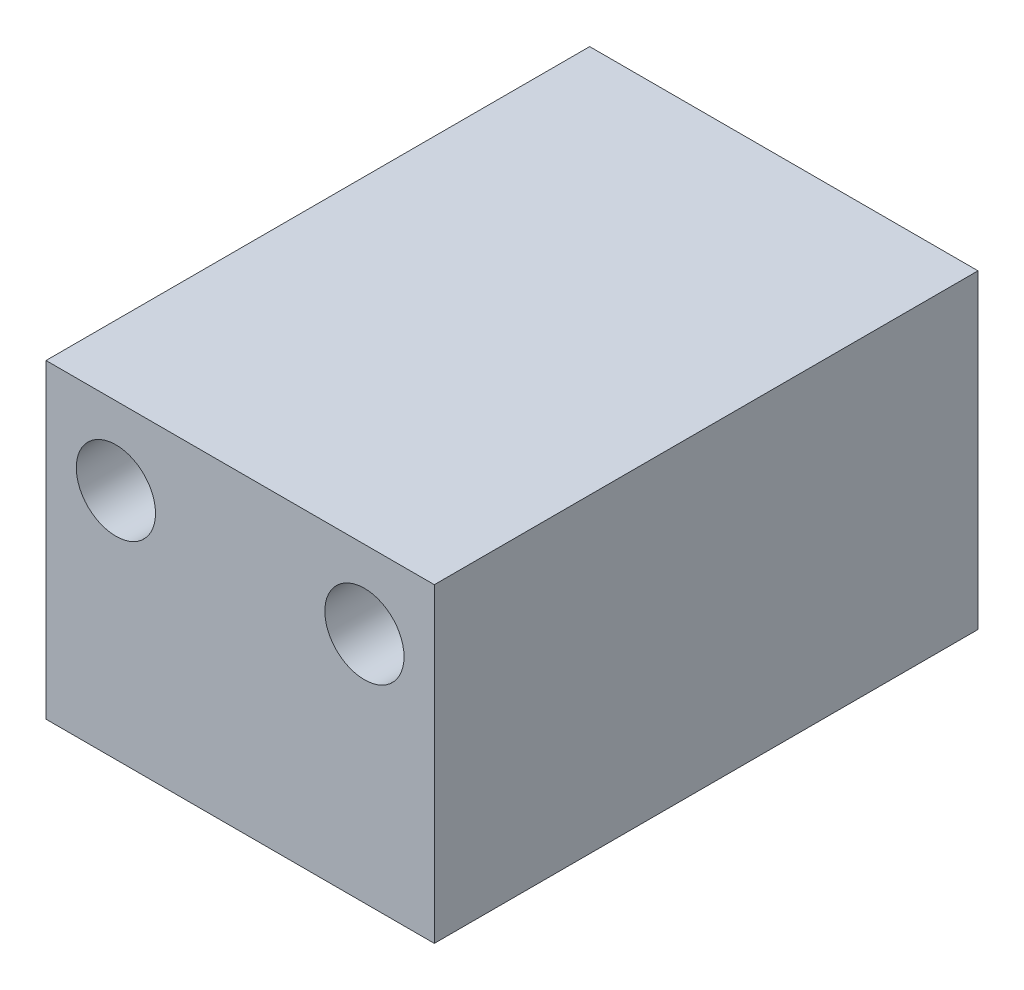
ISO-10303-21;
HEADER;
FILE_DESCRIPTION(('STEP AP214'),'2;1');
FILE_NAME('part.step','',(''),(''),'','','');
FILE_SCHEMA(('AUTOMOTIVE_DESIGN { 1 0 10303 214 1 1 1 1 }'));
ENDSEC;
DATA;
#1=APPLICATION_CONTEXT('core data for automotive mechanical design processes');
#2=APPLICATION_PROTOCOL_DEFINITION('international standard','automotive_design',2000,#1);
#3=PRODUCT_CONTEXT('',#1,'mechanical');
#4=PRODUCT('Part','Part','',(#3));
#5=PRODUCT_RELATED_PRODUCT_CATEGORY('part','',(#4));
#6=PRODUCT_DEFINITION_FORMATION('','',#4);
#7=PRODUCT_DEFINITION_CONTEXT('part definition',#1,'design');
#8=PRODUCT_DEFINITION('design','',#6,#7);
#9=PRODUCT_DEFINITION_SHAPE('','',#8);
#10=(LENGTH_UNIT() NAMED_UNIT(*) SI_UNIT(.MILLI.,.METRE.));
#11=(NAMED_UNIT(*) PLANE_ANGLE_UNIT() SI_UNIT($,.RADIAN.));
#12=(NAMED_UNIT(*) SI_UNIT($,.STERADIAN.) SOLID_ANGLE_UNIT());
#13=UNCERTAINTY_MEASURE_WITH_UNIT(LENGTH_MEASURE(1.E-05),#10,'distance_accuracy_value','');
#14=(GEOMETRIC_REPRESENTATION_CONTEXT(3) GLOBAL_UNCERTAINTY_ASSIGNED_CONTEXT((#13)) GLOBAL_UNIT_ASSIGNED_CONTEXT((#10,
#11,#12)) REPRESENTATION_CONTEXT('',''));
#15=CARTESIAN_POINT('',(0.,0.,0.));
#16=DIRECTION('',(0.,0.,1.));
#17=DIRECTION('',(1.,0.,0.));
#18=AXIS2_PLACEMENT_3D('',#15,#16,#17);
#19=CARTESIAN_POINT('',(0.,20.,0.));
#20=DIRECTION('',(1.,0.,0.));
#21=DIRECTION('',(0.,0.,-1.));
#22=AXIS2_PLACEMENT_3D('',#19,#20,#21);
#23=PLANE('',#22);
#24=DIRECTION('',(0.,0.,1.));
#25=VECTOR('',#24,1.);
#26=CARTESIAN_POINT('',(0.,0.,0.));
#27=LINE('',#26,#25);
#28=CARTESIAN_POINT('',(0.,0.,-35.));
#29=VERTEX_POINT('',#28);
#30=CARTESIAN_POINT('',(0.,0.,0.));
#31=VERTEX_POINT('',#30);
#32=EDGE_CURVE('E97',#29,#31,#27,.T.);
#33=ORIENTED_EDGE('',*,*,#32,.T.);
#34=DIRECTION('',(0.,-1.,0.));
#35=VECTOR('',#34,1.);
#36=CARTESIAN_POINT('',(0.,20.,0.));
#37=LINE('',#36,#35);
#38=CARTESIAN_POINT('',(0.,20.,0.));
#39=VERTEX_POINT('',#38);
#40=EDGE_CURVE('E11',#39,#31,#37,.T.);
#41=ORIENTED_EDGE('',*,*,#40,.F.);
#42=DIRECTION('',(0.,0.,1.));
#43=VECTOR('',#42,1.);
#44=CARTESIAN_POINT('',(0.,20.,0.));
#45=LINE('',#44,#43);
#46=CARTESIAN_POINT('',(0.,20.,-35.));
#47=VERTEX_POINT('',#46);
#48=EDGE_CURVE('E85',#47,#39,#45,.T.);
#49=ORIENTED_EDGE('',*,*,#48,.F.);
#50=DIRECTION('',(0.,-1.,0.));
#51=VECTOR('',#50,1.);
#52=CARTESIAN_POINT('',(0.,20.,-35.));
#53=LINE('',#52,#51);
#54=EDGE_CURVE('E93',#47,#29,#53,.T.);
#55=ORIENTED_EDGE('',*,*,#54,.T.);
#56=EDGE_LOOP('',(#33,#41,#49,#55));
#57=FACE_BOUND('',#56,.T.);
#58=ADVANCED_FACE('F34',(#57),#23,.F.);
#59=CARTESIAN_POINT('',(0.,20.,0.));
#60=DIRECTION('',(0.,0.,-1.));
#61=DIRECTION('',(-1.,0.,0.));
#62=AXIS2_PLACEMENT_3D('',#59,#60,#61);
#63=PLANE('',#62);
#64=CARTESIAN_POINT('',(20.5,15.,0.));
#65=DIRECTION('',(0.,0.,1.));
#66=DIRECTION('',(1.,0.,0.));
#67=AXIS2_PLACEMENT_3D('',#64,#65,#66);
#68=CIRCLE('',#67,2.55);
#69=CARTESIAN_POINT('',(23.05,15.,0.));
#70=VERTEX_POINT('',#69);
#71=EDGE_CURVE('E117',#70,#70,#68,.T.);
#72=ORIENTED_EDGE('',*,*,#71,.F.);
#73=EDGE_LOOP('',(#72));
#74=FACE_BOUND('',#73,.T.);
#75=CARTESIAN_POINT('',(4.5,15.,0.));
#76=DIRECTION('',(0.,0.,1.));
#77=DIRECTION('',(1.,0.,0.));
#78=AXIS2_PLACEMENT_3D('',#75,#76,#77);
#79=CIRCLE('',#78,2.55);
#80=CARTESIAN_POINT('',(7.05,15.,0.));
#81=VERTEX_POINT('',#80);
#82=EDGE_CURVE('E111',#81,#81,#79,.T.);
#83=ORIENTED_EDGE('',*,*,#82,.F.);
#84=EDGE_LOOP('',(#83));
#85=FACE_BOUND('',#84,.T.);
#86=DIRECTION('',(1.,0.,0.));
#87=VECTOR('',#86,1.);
#88=CARTESIAN_POINT('',(0.,0.,0.));
#89=LINE('',#88,#87);
#90=CARTESIAN_POINT('',(25.,0.,0.));
#91=VERTEX_POINT('',#90);
#92=EDGE_CURVE('E89',#31,#91,#89,.T.);
#93=ORIENTED_EDGE('',*,*,#92,.T.);
#94=DIRECTION('',(0.,-1.,0.));
#95=VECTOR('',#94,1.);
#96=CARTESIAN_POINT('',(25.,20.,0.));
#97=LINE('',#96,#95);
#98=CARTESIAN_POINT('',(25.,20.,0.));
#99=VERTEX_POINT('',#98);
#100=EDGE_CURVE('E42',#99,#91,#97,.T.);
#101=ORIENTED_EDGE('',*,*,#100,.F.);
#102=DIRECTION('',(1.,0.,0.));
#103=VECTOR('',#102,1.);
#104=CARTESIAN_POINT('',(0.,20.,0.));
#105=LINE('',#104,#103);
#106=EDGE_CURVE('E80',#39,#99,#105,.T.);
#107=ORIENTED_EDGE('',*,*,#106,.F.);
#108=ORIENTED_EDGE('',*,*,#40,.T.);
#109=EDGE_LOOP('',(#93,#101,#107,#108));
#110=FACE_BOUND('',#109,.T.);
#111=ADVANCED_FACE('F88',(#74,#85,#110),#63,.F.);
#112=CARTESIAN_POINT('',(25.,20.,0.));
#113=DIRECTION('',(-1.,0.,0.));
#114=DIRECTION('',(0.,0.,1.));
#115=AXIS2_PLACEMENT_3D('',#112,#113,#114);
#116=PLANE('',#115);
#117=DIRECTION('',(0.,0.,-1.));
#118=VECTOR('',#117,1.);
#119=CARTESIAN_POINT('',(25.,0.,0.));
#120=LINE('',#119,#118);
#121=CARTESIAN_POINT('',(25.,0.,-35.));
#122=VERTEX_POINT('',#121);
#123=EDGE_CURVE('E67',#91,#122,#120,.T.);
#124=ORIENTED_EDGE('',*,*,#123,.T.);
#125=DIRECTION('',(0.,-1.,0.));
#126=VECTOR('',#125,1.);
#127=CARTESIAN_POINT('',(25.,20.,-35.));
#128=LINE('',#127,#126);
#129=CARTESIAN_POINT('',(25.,20.,-35.));
#130=VERTEX_POINT('',#129);
#131=EDGE_CURVE('E90',#130,#122,#128,.T.);
#132=ORIENTED_EDGE('',*,*,#131,.F.);
#133=DIRECTION('',(0.,0.,-1.));
#134=VECTOR('',#133,1.);
#135=CARTESIAN_POINT('',(25.,20.,0.));
#136=LINE('',#135,#134);
#137=EDGE_CURVE('E83',#99,#130,#136,.T.);
#138=ORIENTED_EDGE('',*,*,#137,.F.);
#139=ORIENTED_EDGE('',*,*,#100,.T.);
#140=EDGE_LOOP('',(#124,#132,#138,#139));
#141=FACE_BOUND('',#140,.T.);
#142=ADVANCED_FACE('F91',(#141),#116,.F.);
#143=CARTESIAN_POINT('',(0.,20.,-35.));
#144=DIRECTION('',(0.,0.,1.));
#145=DIRECTION('',(1.,0.,0.));
#146=AXIS2_PLACEMENT_3D('',#143,#144,#145);
#147=PLANE('',#146);
#148=CARTESIAN_POINT('',(20.5,15.,-35.));
#149=DIRECTION('',(0.,0.,1.));
#150=DIRECTION('',(1.,0.,0.));
#151=AXIS2_PLACEMENT_3D('',#148,#149,#150);
#152=CIRCLE('',#151,2.55);
#153=CARTESIAN_POINT('',(23.05,15.,-35.));
#154=VERTEX_POINT('',#153);
#155=EDGE_CURVE('E114',#154,#154,#152,.T.);
#156=ORIENTED_EDGE('',*,*,#155,.T.);
#157=EDGE_LOOP('',(#156));
#158=FACE_BOUND('',#157,.T.);
#159=CARTESIAN_POINT('',(4.5,15.,-35.));
#160=DIRECTION('',(0.,0.,1.));
#161=DIRECTION('',(1.,0.,0.));
#162=AXIS2_PLACEMENT_3D('',#159,#160,#161);
#163=CIRCLE('',#162,2.55);
#164=CARTESIAN_POINT('',(7.05,15.,-35.));
#165=VERTEX_POINT('',#164);
#166=EDGE_CURVE('E100',#165,#165,#163,.T.);
#167=ORIENTED_EDGE('',*,*,#166,.T.);
#168=EDGE_LOOP('',(#167));
#169=FACE_BOUND('',#168,.T.);
#170=DIRECTION('',(-1.,0.,0.));
#171=VECTOR('',#170,1.);
#172=CARTESIAN_POINT('',(0.,0.,-35.));
#173=LINE('',#172,#171);
#174=EDGE_CURVE('E73',#122,#29,#173,.T.);
#175=ORIENTED_EDGE('',*,*,#174,.T.);
#176=ORIENTED_EDGE('',*,*,#54,.F.);
#177=DIRECTION('',(-1.,0.,0.));
#178=VECTOR('',#177,1.);
#179=CARTESIAN_POINT('',(0.,20.,-35.));
#180=LINE('',#179,#178);
#181=EDGE_CURVE('E50',#130,#47,#180,.T.);
#182=ORIENTED_EDGE('',*,*,#181,.F.);
#183=ORIENTED_EDGE('',*,*,#131,.T.);
#184=EDGE_LOOP('',(#175,#176,#182,#183));
#185=FACE_BOUND('',#184,.T.);
#186=ADVANCED_FACE('F105',(#158,#169,#185),#147,.F.);
#187=CARTESIAN_POINT('',(0.,20.,-35.));
#188=DIRECTION('',(0.,-1.,0.));
#189=DIRECTION('',(0.,0.,-1.));
#190=AXIS2_PLACEMENT_3D('',#187,#188,#189);
#191=PLANE('',#190);
#192=ORIENTED_EDGE('',*,*,#48,.T.);
#193=ORIENTED_EDGE('',*,*,#106,.T.);
#194=ORIENTED_EDGE('',*,*,#137,.T.);
#195=ORIENTED_EDGE('',*,*,#181,.T.);
#196=EDGE_LOOP('',(#192,#193,#194,#195));
#197=FACE_BOUND('',#196,.T.);
#198=ADVANCED_FACE('F81',(#197),#191,.F.);
#199=CARTESIAN_POINT('',(0.,0.,-35.));
#200=DIRECTION('',(0.,-1.,0.));
#201=DIRECTION('',(0.,0.,-1.));
#202=AXIS2_PLACEMENT_3D('',#199,#200,#201);
#203=PLANE('',#202);
#204=CARTESIAN_POINT('',(12.5,0.,-30.));
#205=DIRECTION('',(0.,-1.,0.));
#206=DIRECTION('',(0.,0.,-1.));
#207=AXIS2_PLACEMENT_3D('',#204,#205,#206);
#208=CIRCLE('',#207,2.25);
#209=CARTESIAN_POINT('',(12.5,0.,-32.25));
#210=VERTEX_POINT('',#209);
#211=EDGE_CURVE('E129',#210,#210,#208,.T.);
#212=ORIENTED_EDGE('',*,*,#211,.F.);
#213=EDGE_LOOP('',(#212));
#214=FACE_BOUND('',#213,.T.);
#215=CARTESIAN_POINT('',(12.5,0.,-5.));
#216=DIRECTION('',(0.,-1.,0.));
#217=DIRECTION('',(0.,0.,-1.));
#218=AXIS2_PLACEMENT_3D('',#215,#216,#217);
#219=CIRCLE('',#218,2.25);
#220=CARTESIAN_POINT('',(12.5,0.,-7.25));
#221=VERTEX_POINT('',#220);
#222=EDGE_CURVE('E123',#221,#221,#219,.T.);
#223=ORIENTED_EDGE('',*,*,#222,.F.);
#224=EDGE_LOOP('',(#223));
#225=FACE_BOUND('',#224,.T.);
#226=ORIENTED_EDGE('',*,*,#32,.F.);
#227=ORIENTED_EDGE('',*,*,#174,.F.);
#228=ORIENTED_EDGE('',*,*,#123,.F.);
#229=ORIENTED_EDGE('',*,*,#92,.F.);
#230=EDGE_LOOP('',(#226,#227,#228,#229));
#231=FACE_BOUND('',#230,.T.);
#232=ADVANCED_FACE('F108',(#214,#225,#231),#203,.T.);
#233=CARTESIAN_POINT('',(4.5,15.,-35.));
#234=DIRECTION('',(0.,0.,1.));
#235=DIRECTION('',(1.,0.,0.));
#236=AXIS2_PLACEMENT_3D('',#233,#234,#235);
#237=CYLINDRICAL_SURFACE('',#236,2.55);
#238=ORIENTED_EDGE('',*,*,#166,.F.);
#239=EDGE_LOOP('',(#238));
#240=FACE_BOUND('',#239,.T.);
#241=ORIENTED_EDGE('',*,*,#82,.T.);
#242=EDGE_LOOP('',(#241));
#243=FACE_BOUND('',#242,.T.);
#244=ADVANCED_FACE('F146',(#240,#243),#237,.F.);
#245=CARTESIAN_POINT('',(20.5,15.,-35.));
#246=DIRECTION('',(0.,0.,1.));
#247=DIRECTION('',(1.,0.,0.));
#248=AXIS2_PLACEMENT_3D('',#245,#246,#247);
#249=CYLINDRICAL_SURFACE('',#248,2.55);
#250=ORIENTED_EDGE('',*,*,#155,.F.);
#251=EDGE_LOOP('',(#250));
#252=FACE_BOUND('',#251,.T.);
#253=ORIENTED_EDGE('',*,*,#71,.T.);
#254=EDGE_LOOP('',(#253));
#255=FACE_BOUND('',#254,.T.);
#256=ADVANCED_FACE('F152',(#252,#255),#249,.F.);
#257=CARTESIAN_POINT('',(12.5,10.,-5.));
#258=DIRECTION('',(0.,-1.,0.));
#259=DIRECTION('',(0.,0.,-1.));
#260=AXIS2_PLACEMENT_3D('',#257,#258,#259);
#261=CYLINDRICAL_SURFACE('',#260,2.25);
#262=CARTESIAN_POINT('',(12.5,10.,-5.));
#263=DIRECTION('',(0.,-1.,0.));
#264=DIRECTION('',(0.,0.,-1.));
#265=AXIS2_PLACEMENT_3D('',#262,#263,#264);
#266=CIRCLE('',#265,2.25);
#267=CARTESIAN_POINT('',(12.5,10.,-7.25));
#268=VERTEX_POINT('',#267);
#269=EDGE_CURVE('E120',#268,#268,#266,.T.);
#270=ORIENTED_EDGE('',*,*,#269,.F.);
#271=EDGE_LOOP('',(#270));
#272=FACE_BOUND('',#271,.T.);
#273=ORIENTED_EDGE('',*,*,#222,.T.);
#274=EDGE_LOOP('',(#273));
#275=FACE_BOUND('',#274,.T.);
#276=ADVANCED_FACE('F150',(#272,#275),#261,.F.);
#277=CARTESIAN_POINT('',(12.5,10.,-5.));
#278=DIRECTION('',(0.,-1.,0.));
#279=DIRECTION('',(0.,0.,-1.));
#280=AXIS2_PLACEMENT_3D('',#277,#278,#279);
#281=PLANE('',#280);
#282=ORIENTED_EDGE('',*,*,#269,.T.);
#283=EDGE_LOOP('',(#282));
#284=FACE_BOUND('',#283,.T.);
#285=ADVANCED_FACE('F140',(#284),#281,.T.);
#286=CARTESIAN_POINT('',(12.5,10.,-30.));
#287=DIRECTION('',(0.,-1.,0.));
#288=DIRECTION('',(0.,0.,-1.));
#289=AXIS2_PLACEMENT_3D('',#286,#287,#288);
#290=CYLINDRICAL_SURFACE('',#289,2.25);
#291=CARTESIAN_POINT('',(12.5,10.,-30.));
#292=DIRECTION('',(0.,-1.,0.));
#293=DIRECTION('',(0.,0.,-1.));
#294=AXIS2_PLACEMENT_3D('',#291,#292,#293);
#295=CIRCLE('',#294,2.25);
#296=CARTESIAN_POINT('',(12.5,10.,-32.25));
#297=VERTEX_POINT('',#296);
#298=EDGE_CURVE('E126',#297,#297,#295,.T.);
#299=ORIENTED_EDGE('',*,*,#298,.F.);
#300=EDGE_LOOP('',(#299));
#301=FACE_BOUND('',#300,.T.);
#302=ORIENTED_EDGE('',*,*,#211,.T.);
#303=EDGE_LOOP('',(#302));
#304=FACE_BOUND('',#303,.T.);
#305=ADVANCED_FACE('F137',(#301,#304),#290,.F.);
#306=CARTESIAN_POINT('',(12.5,10.,-30.));
#307=DIRECTION('',(0.,-1.,0.));
#308=DIRECTION('',(0.,0.,-1.));
#309=AXIS2_PLACEMENT_3D('',#306,#307,#308);
#310=PLANE('',#309);
#311=ORIENTED_EDGE('',*,*,#298,.T.);
#312=EDGE_LOOP('',(#311));
#313=FACE_BOUND('',#312,.T.);
#314=ADVANCED_FACE('F135',(#313),#310,.T.);
#315=CLOSED_SHELL('',(#58,#111,#142,#186,#198,#232,#244,#256,#276,#285,#305,#314));
#316=MANIFOLD_SOLID_BREP('B2',#315);
#317=ADVANCED_BREP_SHAPE_REPRESENTATION('',(#18,#316),#14);
#318=SHAPE_DEFINITION_REPRESENTATION(#9,#317);
ENDSEC;
END-ISO-10303-21;
